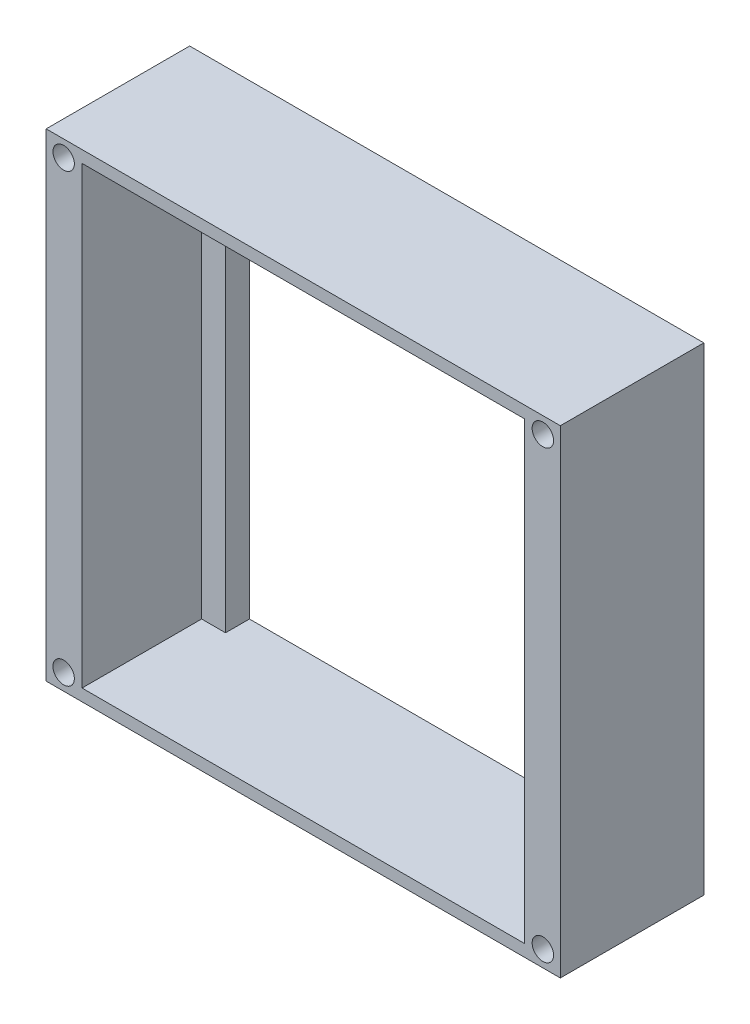
ISO-10303-21;
HEADER;
FILE_DESCRIPTION(('STEP AP214'),'2;1');
FILE_NAME('part.step','',(''),(''),'','','');
FILE_SCHEMA(('AUTOMOTIVE_DESIGN { 1 0 10303 214 1 1 1 1 }'));
ENDSEC;
DATA;
#1=APPLICATION_CONTEXT('core data for automotive mechanical design processes');
#2=APPLICATION_PROTOCOL_DEFINITION('international standard','automotive_design',2000,#1);
#3=PRODUCT_CONTEXT('',#1,'mechanical');
#4=PRODUCT('Part','Part','',(#3));
#5=PRODUCT_RELATED_PRODUCT_CATEGORY('part','',(#4));
#6=PRODUCT_DEFINITION_FORMATION('','',#4);
#7=PRODUCT_DEFINITION_CONTEXT('part definition',#1,'design');
#8=PRODUCT_DEFINITION('design','',#6,#7);
#9=PRODUCT_DEFINITION_SHAPE('','',#8);
#10=(LENGTH_UNIT() NAMED_UNIT(*) SI_UNIT(.MILLI.,.METRE.));
#11=(NAMED_UNIT(*) PLANE_ANGLE_UNIT() SI_UNIT($,.RADIAN.));
#12=(NAMED_UNIT(*) SI_UNIT($,.STERADIAN.) SOLID_ANGLE_UNIT());
#13=UNCERTAINTY_MEASURE_WITH_UNIT(LENGTH_MEASURE(1.E-05),#10,'distance_accuracy_value','');
#14=(GEOMETRIC_REPRESENTATION_CONTEXT(3) GLOBAL_UNCERTAINTY_ASSIGNED_CONTEXT((#13)) GLOBAL_UNIT_ASSIGNED_CONTEXT((#10,
#11,#12)) REPRESENTATION_CONTEXT('',''));
#15=CARTESIAN_POINT('',(0.,0.,0.));
#16=DIRECTION('',(0.,0.,1.));
#17=DIRECTION('',(1.,0.,0.));
#18=AXIS2_PLACEMENT_3D('',#15,#16,#17);
#19=CARTESIAN_POINT('',(0.,0.,-38.1));
#20=DIRECTION('',(0.,0.,1.));
#21=DIRECTION('',(1.,0.,0.));
#22=AXIS2_PLACEMENT_3D('',#19,#20,#21);
#23=PLANE('',#22);
#24=DIRECTION('',(0.,-1.,0.));
#25=VECTOR('',#24,1.);
#26=CARTESIAN_POINT('',(-68.2625,-63.5,-38.1));
#27=LINE('',#26,#25);
#28=CARTESIAN_POINT('',(-68.2625,63.5,-38.1));
#29=VERTEX_POINT('',#28);
#30=CARTESIAN_POINT('',(-68.2625,-63.5,-38.1));
#31=VERTEX_POINT('',#30);
#32=EDGE_CURVE('E194',#29,#31,#27,.T.);
#33=ORIENTED_EDGE('',*,*,#32,.F.);
#34=DIRECTION('',(-1.,0.,0.));
#35=VECTOR('',#34,1.);
#36=CARTESIAN_POINT('',(68.2625,63.5,-38.1));
#37=LINE('',#36,#35);
#38=CARTESIAN_POINT('',(68.2625,63.5,-38.1));
#39=VERTEX_POINT('',#38);
#40=EDGE_CURVE('E204',#39,#29,#37,.T.);
#41=ORIENTED_EDGE('',*,*,#40,.F.);
#42=DIRECTION('',(0.,1.,0.));
#43=VECTOR('',#42,1.);
#44=CARTESIAN_POINT('',(68.2625,-63.5,-38.1));
#45=LINE('',#44,#43);
#46=CARTESIAN_POINT('',(68.2625,-63.5,-38.1));
#47=VERTEX_POINT('',#46);
#48=EDGE_CURVE('E201',#47,#39,#45,.T.);
#49=ORIENTED_EDGE('',*,*,#48,.F.);
#50=DIRECTION('',(1.,0.,0.));
#51=VECTOR('',#50,1.);
#52=CARTESIAN_POINT('',(68.2625,-63.5,-38.1));
#53=LINE('',#52,#51);
#54=EDGE_CURVE('E197',#31,#47,#53,.T.);
#55=ORIENTED_EDGE('',*,*,#54,.F.);
#56=EDGE_LOOP('',(#33,#41,#49,#55));
#57=FACE_BOUND('',#56,.T.);
#58=DIRECTION('',(1.,0.,0.));
#59=VECTOR('',#58,1.);
#60=CARTESIAN_POINT('',(-52.3875,-60.325,-38.1));
#61=LINE('',#60,#59);
#62=CARTESIAN_POINT('',(-52.3875,-60.325,-38.1));
#63=VERTEX_POINT('',#62);
#64=CARTESIAN_POINT('',(52.3875,-60.325,-38.1));
#65=VERTEX_POINT('',#64);
#66=EDGE_CURVE('E55',#63,#65,#61,.T.);
#67=ORIENTED_EDGE('',*,*,#66,.T.);
#68=DIRECTION('',(0.,1.,0.));
#69=VECTOR('',#68,1.);
#70=CARTESIAN_POINT('',(52.3875,-60.325,-38.1));
#71=LINE('',#70,#69);
#72=CARTESIAN_POINT('',(52.3875,60.325,-38.1));
#73=VERTEX_POINT('',#72);
#74=EDGE_CURVE('E139',#65,#73,#71,.T.);
#75=ORIENTED_EDGE('',*,*,#74,.T.);
#76=DIRECTION('',(1.,0.,0.));
#77=VECTOR('',#76,1.);
#78=CARTESIAN_POINT('',(-52.3875,60.325,-38.1));
#79=LINE('',#78,#77);
#80=CARTESIAN_POINT('',(-52.3875,60.325,-38.1));
#81=VERTEX_POINT('',#80);
#82=EDGE_CURVE('E145',#81,#73,#79,.T.);
#83=ORIENTED_EDGE('',*,*,#82,.F.);
#84=DIRECTION('',(0.,1.,0.));
#85=VECTOR('',#84,1.);
#86=CARTESIAN_POINT('',(-52.3875,-60.325,-38.1));
#87=LINE('',#86,#85);
#88=EDGE_CURVE('E148',#63,#81,#87,.T.);
#89=ORIENTED_EDGE('',*,*,#88,.F.);
#90=EDGE_LOOP('',(#67,#75,#83,#89));
#91=FACE_BOUND('',#90,.T.);
#92=ADVANCED_FACE('F40',(#57,#91),#23,.F.);
#93=CARTESIAN_POINT('',(0.,0.,-31.75));
#94=DIRECTION('',(0.,0.,-1.));
#95=DIRECTION('',(-1.,0.,0.));
#96=AXIS2_PLACEMENT_3D('',#93,#94,#95);
#97=PLANE('',#96);
#98=DIRECTION('',(0.,1.,0.));
#99=VECTOR('',#98,1.);
#100=CARTESIAN_POINT('',(52.3875,0.,-31.75));
#101=LINE('',#100,#99);
#102=CARTESIAN_POINT('',(52.3875,-60.325,-31.75));
#103=VERTEX_POINT('',#102);
#104=CARTESIAN_POINT('',(52.3875,60.325,-31.75));
#105=VERTEX_POINT('',#104);
#106=EDGE_CURVE('E11',#103,#105,#101,.T.);
#107=ORIENTED_EDGE('',*,*,#106,.F.);
#108=DIRECTION('',(-1.,0.,0.));
#109=VECTOR('',#108,1.);
#110=CARTESIAN_POINT('',(58.7375,-60.325,-31.75));
#111=LINE('',#110,#109);
#112=CARTESIAN_POINT('',(58.7375,-60.325,-31.75));
#113=VERTEX_POINT('',#112);
#114=EDGE_CURVE('E132',#113,#103,#111,.T.);
#115=ORIENTED_EDGE('',*,*,#114,.F.);
#116=DIRECTION('',(0.,1.,0.));
#117=VECTOR('',#116,1.);
#118=CARTESIAN_POINT('',(58.7375,-60.325,-31.75));
#119=LINE('',#118,#117);
#120=CARTESIAN_POINT('',(58.7375,60.325,-31.75));
#121=VERTEX_POINT('',#120);
#122=EDGE_CURVE('E171',#113,#121,#119,.T.);
#123=ORIENTED_EDGE('',*,*,#122,.T.);
#124=DIRECTION('',(-1.,0.,0.));
#125=VECTOR('',#124,1.);
#126=CARTESIAN_POINT('',(58.7375,60.325,-31.75));
#127=LINE('',#126,#125);
#128=EDGE_CURVE('E168',#121,#105,#127,.T.);
#129=ORIENTED_EDGE('',*,*,#128,.T.);
#130=EDGE_LOOP('',(#107,#115,#123,#129));
#131=FACE_BOUND('',#130,.T.);
#132=ADVANCED_FACE('F245',(#131),#97,.F.);
#133=CARTESIAN_POINT('',(0.,0.,0.));
#134=DIRECTION('',(0.,0.,1.));
#135=DIRECTION('',(1.,0.,0.));
#136=AXIS2_PLACEMENT_3D('',#133,#134,#135);
#137=PLANE('',#136);
#138=CARTESIAN_POINT('',(-63.62065,-59.182,0.));
#139=DIRECTION('',(0.,0.,1.));
#140=DIRECTION('',(-1.,0.,0.));
#141=AXIS2_PLACEMENT_3D('',#138,#139,#140);
#142=CIRCLE('',#141,2.8448);
#143=CARTESIAN_POINT('',(-66.46545,-59.182,0.));
#144=VERTEX_POINT('',#143);
#145=EDGE_CURVE('E482',#144,#144,#142,.T.);
#146=ORIENTED_EDGE('',*,*,#145,.F.);
#147=EDGE_LOOP('',(#146));
#148=FACE_BOUND('',#147,.T.);
#149=CARTESIAN_POINT('',(63.62065,-59.182,0.));
#150=DIRECTION('',(0.,0.,1.));
#151=DIRECTION('',(1.,0.,0.));
#152=AXIS2_PLACEMENT_3D('',#149,#150,#151);
#153=CIRCLE('',#152,2.8448);
#154=CARTESIAN_POINT('',(66.46545,-59.182,0.));
#155=VERTEX_POINT('',#154);
#156=EDGE_CURVE('E490',#155,#155,#153,.T.);
#157=ORIENTED_EDGE('',*,*,#156,.F.);
#158=EDGE_LOOP('',(#157));
#159=FACE_BOUND('',#158,.T.);
#160=CARTESIAN_POINT('',(63.62065,59.182,0.));
#161=DIRECTION('',(0.,0.,1.));
#162=DIRECTION('',(-1.,0.,0.));
#163=AXIS2_PLACEMENT_3D('',#160,#161,#162);
#164=CIRCLE('',#163,2.8448);
#165=CARTESIAN_POINT('',(60.77585,59.182,0.));
#166=VERTEX_POINT('',#165);
#167=EDGE_CURVE('E496',#166,#166,#164,.T.);
#168=ORIENTED_EDGE('',*,*,#167,.F.);
#169=EDGE_LOOP('',(#168));
#170=FACE_BOUND('',#169,.T.);
#171=CARTESIAN_POINT('',(-63.62065,59.182,0.));
#172=DIRECTION('',(0.,0.,1.));
#173=DIRECTION('',(1.,0.,0.));
#174=AXIS2_PLACEMENT_3D('',#171,#172,#173);
#175=CIRCLE('',#174,2.8448);
#176=CARTESIAN_POINT('',(-60.77585,59.182,0.));
#177=VERTEX_POINT('',#176);
#178=EDGE_CURVE('E152',#177,#177,#175,.T.);
#179=ORIENTED_EDGE('',*,*,#178,.F.);
#180=EDGE_LOOP('',(#179));
#181=FACE_BOUND('',#180,.T.);
#182=DIRECTION('',(0.,-1.,0.));
#183=VECTOR('',#182,1.);
#184=CARTESIAN_POINT('',(-68.2625,-63.5,0.));
#185=LINE('',#184,#183);
#186=CARTESIAN_POINT('',(-68.2625,63.5,0.));
#187=VERTEX_POINT('',#186);
#188=CARTESIAN_POINT('',(-68.2625,-63.5,0.));
#189=VERTEX_POINT('',#188);
#190=EDGE_CURVE('E193',#187,#189,#185,.T.);
#191=ORIENTED_EDGE('',*,*,#190,.T.);
#192=DIRECTION('',(1.,0.,0.));
#193=VECTOR('',#192,1.);
#194=CARTESIAN_POINT('',(68.2625,-63.5,0.));
#195=LINE('',#194,#193);
#196=CARTESIAN_POINT('',(68.2625,-63.5,0.));
#197=VERTEX_POINT('',#196);
#198=EDGE_CURVE('E210',#189,#197,#195,.T.);
#199=ORIENTED_EDGE('',*,*,#198,.T.);
#200=DIRECTION('',(0.,1.,0.));
#201=VECTOR('',#200,1.);
#202=CARTESIAN_POINT('',(68.2625,-63.5,0.));
#203=LINE('',#202,#201);
#204=CARTESIAN_POINT('',(68.2625,63.5,0.));
#205=VERTEX_POINT('',#204);
#206=EDGE_CURVE('E213',#197,#205,#203,.T.);
#207=ORIENTED_EDGE('',*,*,#206,.T.);
#208=DIRECTION('',(-1.,0.,0.));
#209=VECTOR('',#208,1.);
#210=CARTESIAN_POINT('',(68.2625,63.5,0.));
#211=LINE('',#210,#209);
#212=EDGE_CURVE('E198',#205,#187,#211,.T.);
#213=ORIENTED_EDGE('',*,*,#212,.T.);
#214=EDGE_LOOP('',(#191,#199,#207,#213));
#215=FACE_BOUND('',#214,.T.);
#216=DIRECTION('',(0.,1.,0.));
#217=VECTOR('',#216,1.);
#218=CARTESIAN_POINT('',(58.7375,-60.325,0.));
#219=LINE('',#218,#217);
#220=CARTESIAN_POINT('',(58.7375,-60.325,0.));
#221=VERTEX_POINT('',#220);
#222=CARTESIAN_POINT('',(58.7375,60.325,0.));
#223=VERTEX_POINT('',#222);
#224=EDGE_CURVE('E181',#221,#223,#219,.T.);
#225=ORIENTED_EDGE('',*,*,#224,.F.);
#226=DIRECTION('',(-1.,0.,0.));
#227=VECTOR('',#226,1.);
#228=CARTESIAN_POINT('',(58.7375,-60.325,0.));
#229=LINE('',#228,#227);
#230=CARTESIAN_POINT('',(-58.7375,-60.325,0.));
#231=VERTEX_POINT('',#230);
#232=EDGE_CURVE('E135',#221,#231,#229,.T.);
#233=ORIENTED_EDGE('',*,*,#232,.T.);
#234=DIRECTION('',(0.,1.,0.));
#235=VECTOR('',#234,1.);
#236=CARTESIAN_POINT('',(-58.7375,-60.325,0.));
#237=LINE('',#236,#235);
#238=CARTESIAN_POINT('',(-58.7375,60.325,0.));
#239=VERTEX_POINT('',#238);
#240=EDGE_CURVE('E176',#231,#239,#237,.T.);
#241=ORIENTED_EDGE('',*,*,#240,.T.);
#242=DIRECTION('',(-1.,0.,0.));
#243=VECTOR('',#242,1.);
#244=CARTESIAN_POINT('',(58.7375,60.325,0.));
#245=LINE('',#244,#243);
#246=EDGE_CURVE('E179',#223,#239,#245,.T.);
#247=ORIENTED_EDGE('',*,*,#246,.F.);
#248=EDGE_LOOP('',(#225,#233,#241,#247));
#249=FACE_BOUND('',#248,.T.);
#250=ADVANCED_FACE('F239',(#148,#159,#170,#181,#215,#249),#137,.T.);
#251=CARTESIAN_POINT('',(-68.2625,-63.5,-38.1));
#252=DIRECTION('',(-1.,0.,0.));
#253=DIRECTION('',(0.,0.,1.));
#254=AXIS2_PLACEMENT_3D('',#251,#252,#253);
#255=PLANE('',#254);
#256=ORIENTED_EDGE('',*,*,#190,.F.);
#257=DIRECTION('',(0.,0.,1.));
#258=VECTOR('',#257,1.);
#259=CARTESIAN_POINT('',(-68.2625,63.5,-38.1));
#260=LINE('',#259,#258);
#261=EDGE_CURVE('E218',#29,#187,#260,.T.);
#262=ORIENTED_EDGE('',*,*,#261,.F.);
#263=ORIENTED_EDGE('',*,*,#32,.T.);
#264=DIRECTION('',(0.,0.,1.));
#265=VECTOR('',#264,1.);
#266=CARTESIAN_POINT('',(-68.2625,-63.5,-38.1));
#267=LINE('',#266,#265);
#268=EDGE_CURVE('E207',#31,#189,#267,.T.);
#269=ORIENTED_EDGE('',*,*,#268,.T.);
#270=EDGE_LOOP('',(#256,#262,#263,#269));
#271=FACE_BOUND('',#270,.T.);
#272=ADVANCED_FACE('F42',(#271),#255,.T.);
#273=CARTESIAN_POINT('',(68.2625,63.5,-38.1));
#274=DIRECTION('',(0.,1.,0.));
#275=DIRECTION('',(-1.,0.,0.));
#276=AXIS2_PLACEMENT_3D('',#273,#274,#275);
#277=PLANE('',#276);
#278=ORIENTED_EDGE('',*,*,#212,.F.);
#279=DIRECTION('',(0.,0.,1.));
#280=VECTOR('',#279,1.);
#281=CARTESIAN_POINT('',(68.2625,63.5,-38.1));
#282=LINE('',#281,#280);
#283=EDGE_CURVE('E220',#39,#205,#282,.T.);
#284=ORIENTED_EDGE('',*,*,#283,.F.);
#285=ORIENTED_EDGE('',*,*,#40,.T.);
#286=ORIENTED_EDGE('',*,*,#261,.T.);
#287=EDGE_LOOP('',(#278,#284,#285,#286));
#288=FACE_BOUND('',#287,.T.);
#289=ADVANCED_FACE('F274',(#288),#277,.T.);
#290=CARTESIAN_POINT('',(68.2625,-63.5,-38.1));
#291=DIRECTION('',(1.,0.,0.));
#292=DIRECTION('',(0.,0.,-1.));
#293=AXIS2_PLACEMENT_3D('',#290,#291,#292);
#294=PLANE('',#293);
#295=ORIENTED_EDGE('',*,*,#206,.F.);
#296=DIRECTION('',(0.,0.,1.));
#297=VECTOR('',#296,1.);
#298=CARTESIAN_POINT('',(68.2625,-63.5,-38.1));
#299=LINE('',#298,#297);
#300=EDGE_CURVE('E222',#47,#197,#299,.T.);
#301=ORIENTED_EDGE('',*,*,#300,.F.);
#302=ORIENTED_EDGE('',*,*,#48,.T.);
#303=ORIENTED_EDGE('',*,*,#283,.T.);
#304=EDGE_LOOP('',(#295,#301,#302,#303));
#305=FACE_BOUND('',#304,.T.);
#306=ADVANCED_FACE('F277',(#305),#294,.T.);
#307=CARTESIAN_POINT('',(68.2625,-63.5,-38.1));
#308=DIRECTION('',(0.,-1.,0.));
#309=DIRECTION('',(1.,0.,0.));
#310=AXIS2_PLACEMENT_3D('',#307,#308,#309);
#311=PLANE('',#310);
#312=ORIENTED_EDGE('',*,*,#198,.F.);
#313=ORIENTED_EDGE('',*,*,#268,.F.);
#314=ORIENTED_EDGE('',*,*,#54,.T.);
#315=ORIENTED_EDGE('',*,*,#300,.T.);
#316=EDGE_LOOP('',(#312,#313,#314,#315));
#317=FACE_BOUND('',#316,.T.);
#318=ADVANCED_FACE('F272',(#317),#311,.T.);
#319=CARTESIAN_POINT('',(58.7375,-60.325,-31.75));
#320=DIRECTION('',(0.,1.,0.));
#321=DIRECTION('',(-1.,0.,0.));
#322=AXIS2_PLACEMENT_3D('',#319,#320,#321);
#323=PLANE('',#322);
#324=DIRECTION('',(0.,0.,1.));
#325=VECTOR('',#324,1.);
#326=CARTESIAN_POINT('',(-58.7375,-60.325,-31.75));
#327=LINE('',#326,#325);
#328=CARTESIAN_POINT('',(-58.7375,-60.325,-31.75));
#329=VERTEX_POINT('',#328);
#330=EDGE_CURVE('E191',#329,#231,#327,.T.);
#331=ORIENTED_EDGE('',*,*,#330,.T.);
#332=ORIENTED_EDGE('',*,*,#232,.F.);
#333=DIRECTION('',(0.,0.,1.));
#334=VECTOR('',#333,1.);
#335=CARTESIAN_POINT('',(58.7375,-60.325,-31.75));
#336=LINE('',#335,#334);
#337=EDGE_CURVE('E174',#113,#221,#336,.T.);
#338=ORIENTED_EDGE('',*,*,#337,.F.);
#339=ORIENTED_EDGE('',*,*,#114,.T.);
#340=DIRECTION('',(0.,0.,-1.));
#341=VECTOR('',#340,1.);
#342=CARTESIAN_POINT('',(52.3875,-60.325,0.));
#343=LINE('',#342,#341);
#344=EDGE_CURVE('E127',#103,#65,#343,.T.);
#345=ORIENTED_EDGE('',*,*,#344,.T.);
#346=ORIENTED_EDGE('',*,*,#66,.F.);
#347=DIRECTION('',(0.,0.,-1.));
#348=VECTOR('',#347,1.);
#349=CARTESIAN_POINT('',(-52.3875,-60.325,0.));
#350=LINE('',#349,#348);
#351=CARTESIAN_POINT('',(-52.3875,-60.325,-31.75));
#352=VERTEX_POINT('',#351);
#353=EDGE_CURVE('E158',#352,#63,#350,.T.);
#354=ORIENTED_EDGE('',*,*,#353,.F.);
#355=EDGE_CURVE('E164',#352,#329,#111,.T.);
#356=ORIENTED_EDGE('',*,*,#355,.T.);
#357=EDGE_LOOP('',(#331,#332,#338,#339,#345,#346,#354,#356));
#358=FACE_BOUND('',#357,.T.);
#359=ADVANCED_FACE('F130',(#358),#323,.T.);
#360=CARTESIAN_POINT('',(-58.7375,-60.325,-31.75));
#361=DIRECTION('',(1.,0.,0.));
#362=DIRECTION('',(0.,0.,-1.));
#363=AXIS2_PLACEMENT_3D('',#360,#361,#362);
#364=PLANE('',#363);
#365=ORIENTED_EDGE('',*,*,#240,.F.);
#366=ORIENTED_EDGE('',*,*,#330,.F.);
#367=DIRECTION('',(0.,1.,0.));
#368=VECTOR('',#367,1.);
#369=CARTESIAN_POINT('',(-58.7375,-60.325,-31.75));
#370=LINE('',#369,#368);
#371=CARTESIAN_POINT('',(-58.7375,60.325,-31.75));
#372=VERTEX_POINT('',#371);
#373=EDGE_CURVE('E163',#329,#372,#370,.T.);
#374=ORIENTED_EDGE('',*,*,#373,.T.);
#375=DIRECTION('',(0.,0.,1.));
#376=VECTOR('',#375,1.);
#377=CARTESIAN_POINT('',(-58.7375,60.325,-31.75));
#378=LINE('',#377,#376);
#379=EDGE_CURVE('E188',#372,#239,#378,.T.);
#380=ORIENTED_EDGE('',*,*,#379,.T.);
#381=EDGE_LOOP('',(#365,#366,#374,#380));
#382=FACE_BOUND('',#381,.T.);
#383=ADVANCED_FACE('F235',(#382),#364,.T.);
#384=CARTESIAN_POINT('',(58.7375,60.325,-31.75));
#385=DIRECTION('',(0.,1.,0.));
#386=DIRECTION('',(-1.,0.,0.));
#387=AXIS2_PLACEMENT_3D('',#384,#385,#386);
#388=PLANE('',#387);
#389=CARTESIAN_POINT('',(-52.3875,60.325,-31.75));
#390=VERTEX_POINT('',#389);
#391=EDGE_CURVE('E167',#390,#372,#127,.T.);
#392=ORIENTED_EDGE('',*,*,#391,.F.);
#393=DIRECTION('',(0.,0.,-1.));
#394=VECTOR('',#393,1.);
#395=CARTESIAN_POINT('',(-52.3875,60.325,0.));
#396=LINE('',#395,#394);
#397=EDGE_CURVE('E63',#390,#81,#396,.T.);
#398=ORIENTED_EDGE('',*,*,#397,.T.);
#399=ORIENTED_EDGE('',*,*,#82,.T.);
#400=DIRECTION('',(0.,0.,-1.));
#401=VECTOR('',#400,1.);
#402=CARTESIAN_POINT('',(52.3875,60.325,0.));
#403=LINE('',#402,#401);
#404=EDGE_CURVE('E136',#105,#73,#403,.T.);
#405=ORIENTED_EDGE('',*,*,#404,.F.);
#406=ORIENTED_EDGE('',*,*,#128,.F.);
#407=DIRECTION('',(0.,0.,1.));
#408=VECTOR('',#407,1.);
#409=CARTESIAN_POINT('',(58.7375,60.325,-31.75));
#410=LINE('',#409,#408);
#411=EDGE_CURVE('E186',#121,#223,#410,.T.);
#412=ORIENTED_EDGE('',*,*,#411,.T.);
#413=ORIENTED_EDGE('',*,*,#246,.T.);
#414=ORIENTED_EDGE('',*,*,#379,.F.);
#415=EDGE_LOOP('',(#392,#398,#399,#405,#406,#412,#413,#414));
#416=FACE_BOUND('',#415,.T.);
#417=ADVANCED_FACE('F231',(#416),#388,.F.);
#418=CARTESIAN_POINT('',(58.7375,-60.325,-31.75));
#419=DIRECTION('',(1.,0.,0.));
#420=DIRECTION('',(0.,0.,-1.));
#421=AXIS2_PLACEMENT_3D('',#418,#419,#420);
#422=PLANE('',#421);
#423=ORIENTED_EDGE('',*,*,#224,.T.);
#424=ORIENTED_EDGE('',*,*,#411,.F.);
#425=ORIENTED_EDGE('',*,*,#122,.F.);
#426=ORIENTED_EDGE('',*,*,#337,.T.);
#427=EDGE_LOOP('',(#423,#424,#425,#426));
#428=FACE_BOUND('',#427,.T.);
#429=ADVANCED_FACE('F242',(#428),#422,.F.);
#430=ORIENTED_EDGE('',*,*,#355,.F.);
#431=DIRECTION('',(0.,1.,0.));
#432=VECTOR('',#431,1.);
#433=CARTESIAN_POINT('',(-52.3875,0.,-31.75));
#434=LINE('',#433,#432);
#435=EDGE_CURVE('E48',#352,#390,#434,.T.);
#436=ORIENTED_EDGE('',*,*,#435,.T.);
#437=ORIENTED_EDGE('',*,*,#391,.T.);
#438=ORIENTED_EDGE('',*,*,#373,.F.);
#439=EDGE_LOOP('',(#430,#436,#437,#438));
#440=FACE_BOUND('',#439,.T.);
#441=ADVANCED_FACE('F227',(#440),#97,.F.);
#442=CARTESIAN_POINT('',(52.3875,-60.325,0.));
#443=DIRECTION('',(-1.,0.,0.));
#444=DIRECTION('',(0.,-1.,0.));
#445=AXIS2_PLACEMENT_3D('',#442,#443,#444);
#446=PLANE('',#445);
#447=ORIENTED_EDGE('',*,*,#106,.T.);
#448=ORIENTED_EDGE('',*,*,#404,.T.);
#449=ORIENTED_EDGE('',*,*,#74,.F.);
#450=ORIENTED_EDGE('',*,*,#344,.F.);
#451=EDGE_LOOP('',(#447,#448,#449,#450));
#452=FACE_BOUND('',#451,.T.);
#453=ADVANCED_FACE('F140',(#452),#446,.T.);
#454=CARTESIAN_POINT('',(-52.3875,-60.325,0.));
#455=DIRECTION('',(-1.,0.,0.));
#456=DIRECTION('',(0.,0.,1.));
#457=AXIS2_PLACEMENT_3D('',#454,#455,#456);
#458=PLANE('',#457);
#459=ORIENTED_EDGE('',*,*,#353,.T.);
#460=ORIENTED_EDGE('',*,*,#88,.T.);
#461=ORIENTED_EDGE('',*,*,#397,.F.);
#462=ORIENTED_EDGE('',*,*,#435,.F.);
#463=EDGE_LOOP('',(#459,#460,#461,#462));
#464=FACE_BOUND('',#463,.T.);
#465=ADVANCED_FACE('F263',(#464),#458,.F.);
#466=CARTESIAN_POINT('',(-63.62065,59.182,-25.4));
#467=DIRECTION('',(0.,0.,1.));
#468=DIRECTION('',(1.,0.,0.));
#469=AXIS2_PLACEMENT_3D('',#466,#467,#468);
#470=CYLINDRICAL_SURFACE('',#469,2.8448);
#471=CARTESIAN_POINT('',(-63.62065,59.182,-25.4));
#472=DIRECTION('',(0.,0.,1.));
#473=DIRECTION('',(1.,0.,0.));
#474=AXIS2_PLACEMENT_3D('',#471,#472,#473);
#475=CIRCLE('',#474,2.8448);
#476=CARTESIAN_POINT('',(-60.77585,59.182,-25.4));
#477=VERTEX_POINT('',#476);
#478=EDGE_CURVE('E149',#477,#477,#475,.T.);
#479=ORIENTED_EDGE('',*,*,#478,.F.);
#480=EDGE_LOOP('',(#479));
#481=FACE_BOUND('',#480,.T.);
#482=ORIENTED_EDGE('',*,*,#178,.T.);
#483=EDGE_LOOP('',(#482));
#484=FACE_BOUND('',#483,.T.);
#485=ADVANCED_FACE('F372',(#481,#484),#470,.F.);
#486=CARTESIAN_POINT('',(-63.62065,59.182,-25.4));
#487=DIRECTION('',(0.,0.,1.));
#488=DIRECTION('',(1.,0.,0.));
#489=AXIS2_PLACEMENT_3D('',#486,#487,#488);
#490=PLANE('',#489);
#491=ORIENTED_EDGE('',*,*,#478,.T.);
#492=EDGE_LOOP('',(#491));
#493=FACE_BOUND('',#492,.T.);
#494=ADVANCED_FACE('F387',(#493),#490,.T.);
#495=CARTESIAN_POINT('',(63.62065,59.182,-25.4));
#496=DIRECTION('',(0.,0.,1.));
#497=DIRECTION('',(1.,0.,0.));
#498=AXIS2_PLACEMENT_3D('',#495,#496,#497);
#499=CYLINDRICAL_SURFACE('',#498,2.8448);
#500=CARTESIAN_POINT('',(63.62065,59.182,-25.4));
#501=DIRECTION('',(0.,0.,1.));
#502=DIRECTION('',(-1.,0.,0.));
#503=AXIS2_PLACEMENT_3D('',#500,#501,#502);
#504=CIRCLE('',#503,2.8448);
#505=CARTESIAN_POINT('',(60.77585,59.182,-25.4));
#506=VERTEX_POINT('',#505);
#507=EDGE_CURVE('E493',#506,#506,#504,.T.);
#508=ORIENTED_EDGE('',*,*,#507,.F.);
#509=EDGE_LOOP('',(#508));
#510=FACE_BOUND('',#509,.T.);
#511=ORIENTED_EDGE('',*,*,#167,.T.);
#512=EDGE_LOOP('',(#511));
#513=FACE_BOUND('',#512,.T.);
#514=ADVANCED_FACE('F398',(#510,#513),#499,.F.);
#515=CARTESIAN_POINT('',(63.62065,59.182,-25.4));
#516=DIRECTION('',(0.,0.,-1.));
#517=DIRECTION('',(-1.,0.,0.));
#518=AXIS2_PLACEMENT_3D('',#515,#516,#517);
#519=PLANE('',#518);
#520=ORIENTED_EDGE('',*,*,#507,.T.);
#521=EDGE_LOOP('',(#520));
#522=FACE_BOUND('',#521,.T.);
#523=ADVANCED_FACE('F409',(#522),#519,.F.);
#524=CARTESIAN_POINT('',(63.62065,-59.182,-25.4));
#525=DIRECTION('',(0.,0.,1.));
#526=DIRECTION('',(1.,0.,0.));
#527=AXIS2_PLACEMENT_3D('',#524,#525,#526);
#528=CYLINDRICAL_SURFACE('',#527,2.8448);
#529=CARTESIAN_POINT('',(63.62065,-59.182,-25.4));
#530=DIRECTION('',(0.,0.,1.));
#531=DIRECTION('',(1.,0.,0.));
#532=AXIS2_PLACEMENT_3D('',#529,#530,#531);
#533=CIRCLE('',#532,2.8448);
#534=CARTESIAN_POINT('',(66.46545,-59.182,-25.4));
#535=VERTEX_POINT('',#534);
#536=EDGE_CURVE('E485',#535,#535,#533,.T.);
#537=ORIENTED_EDGE('',*,*,#536,.F.);
#538=EDGE_LOOP('',(#537));
#539=FACE_BOUND('',#538,.T.);
#540=ORIENTED_EDGE('',*,*,#156,.T.);
#541=EDGE_LOOP('',(#540));
#542=FACE_BOUND('',#541,.T.);
#543=ADVANCED_FACE('F420',(#539,#542),#528,.F.);
#544=CARTESIAN_POINT('',(63.62065,-59.182,-25.4));
#545=DIRECTION('',(0.,0.,1.));
#546=DIRECTION('',(1.,0.,0.));
#547=AXIS2_PLACEMENT_3D('',#544,#545,#546);
#548=PLANE('',#547);
#549=ORIENTED_EDGE('',*,*,#536,.T.);
#550=EDGE_LOOP('',(#549));
#551=FACE_BOUND('',#550,.T.);
#552=ADVANCED_FACE('F431',(#551),#548,.T.);
#553=CARTESIAN_POINT('',(-63.62065,-59.182,-25.4));
#554=DIRECTION('',(0.,0.,1.));
#555=DIRECTION('',(1.,0.,0.));
#556=AXIS2_PLACEMENT_3D('',#553,#554,#555);
#557=CYLINDRICAL_SURFACE('',#556,2.8448);
#558=CARTESIAN_POINT('',(-63.62065,-59.182,-25.4));
#559=DIRECTION('',(0.,0.,1.));
#560=DIRECTION('',(-1.,0.,0.));
#561=AXIS2_PLACEMENT_3D('',#558,#559,#560);
#562=CIRCLE('',#561,2.8448);
#563=CARTESIAN_POINT('',(-66.46545,-59.182,-25.4));
#564=VERTEX_POINT('',#563);
#565=EDGE_CURVE('E481',#564,#564,#562,.T.);
#566=ORIENTED_EDGE('',*,*,#565,.F.);
#567=EDGE_LOOP('',(#566));
#568=FACE_BOUND('',#567,.T.);
#569=ORIENTED_EDGE('',*,*,#145,.T.);
#570=EDGE_LOOP('',(#569));
#571=FACE_BOUND('',#570,.T.);
#572=ADVANCED_FACE('F442',(#568,#571),#557,.F.);
#573=CARTESIAN_POINT('',(-63.62065,-59.182,-25.4));
#574=DIRECTION('',(0.,0.,-1.));
#575=DIRECTION('',(-1.,0.,0.));
#576=AXIS2_PLACEMENT_3D('',#573,#574,#575);
#577=PLANE('',#576);
#578=ORIENTED_EDGE('',*,*,#565,.T.);
#579=EDGE_LOOP('',(#578));
#580=FACE_BOUND('',#579,.T.);
#581=ADVANCED_FACE('F453',(#580),#577,.F.);
#582=CLOSED_SHELL('',(#92,#132,#250,#272,#289,#306,#318,#359,#383,#417,#429,#441,#453,#465,#485,
#494,#514,#523,#543,#552,#572,#581));
#583=MANIFOLD_SOLID_BREP('B2',#582);
#584=ADVANCED_BREP_SHAPE_REPRESENTATION('',(#18,#583),#14);
#585=SHAPE_DEFINITION_REPRESENTATION(#9,#584);
ENDSEC;
END-ISO-10303-21;
